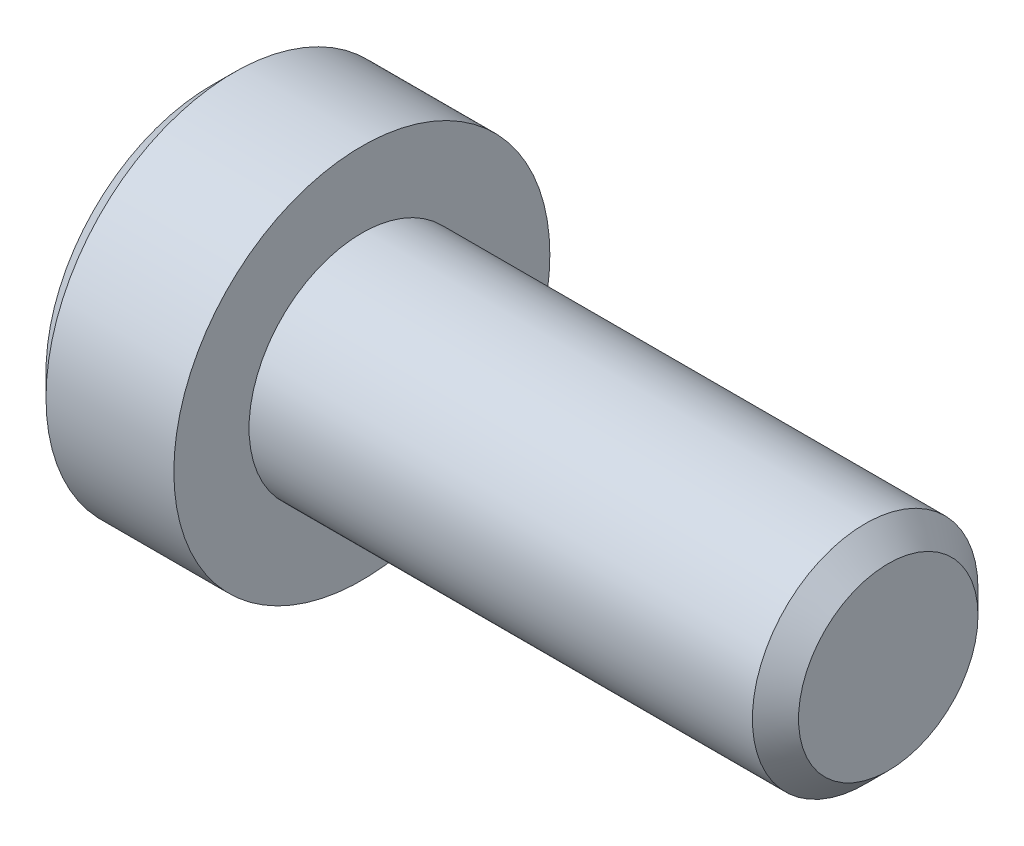
ISO-10303-21;
HEADER;
FILE_DESCRIPTION(('STEP AP214'),'2;1');
FILE_NAME('part.step','',(''),(''),'','','');
FILE_SCHEMA(('AUTOMOTIVE_DESIGN { 1 0 10303 214 1 1 1 1 }'));
ENDSEC;
DATA;
#1=APPLICATION_CONTEXT('core data for automotive mechanical design processes');
#2=APPLICATION_PROTOCOL_DEFINITION('international standard','automotive_design',2000,#1);
#3=PRODUCT_CONTEXT('',#1,'mechanical');
#4=PRODUCT('Part','Part','',(#3));
#5=PRODUCT_RELATED_PRODUCT_CATEGORY('part','',(#4));
#6=PRODUCT_DEFINITION_FORMATION('','',#4);
#7=PRODUCT_DEFINITION_CONTEXT('part definition',#1,'design');
#8=PRODUCT_DEFINITION('design','',#6,#7);
#9=PRODUCT_DEFINITION_SHAPE('','',#8);
#10=(LENGTH_UNIT() NAMED_UNIT(*) SI_UNIT(.MILLI.,.METRE.));
#11=(NAMED_UNIT(*) PLANE_ANGLE_UNIT() SI_UNIT($,.RADIAN.));
#12=(NAMED_UNIT(*) SI_UNIT($,.STERADIAN.) SOLID_ANGLE_UNIT());
#13=UNCERTAINTY_MEASURE_WITH_UNIT(LENGTH_MEASURE(1.E-05),#10,'distance_accuracy_value','');
#14=(GEOMETRIC_REPRESENTATION_CONTEXT(3) GLOBAL_UNCERTAINTY_ASSIGNED_CONTEXT((#13)) GLOBAL_UNIT_ASSIGNED_CONTEXT((#10,
#11,#12)) REPRESENTATION_CONTEXT('',''));
#15=CARTESIAN_POINT('',(0.,0.,0.));
#16=DIRECTION('',(0.,0.,1.));
#17=DIRECTION('',(1.,0.,0.));
#18=AXIS2_PLACEMENT_3D('',#15,#16,#17);
#19=CARTESIAN_POINT('',(-4.,0.,0.));
#20=DIRECTION('',(1.,0.,0.));
#21=DIRECTION('',(0.,0.,-1.));
#22=AXIS2_PLACEMENT_3D('',#19,#20,#21);
#23=PLANE('',#22);
#24=CARTESIAN_POINT('',(-4.,0.,0.));
#25=DIRECTION('',(1.,0.,0.));
#26=DIRECTION('',(0.,0.,-1.));
#27=AXIS2_PLACEMENT_3D('',#24,#25,#26);
#28=CIRCLE('',#27,4.4);
#29=CARTESIAN_POINT('',(-4.,0.,-4.4));
#30=VERTEX_POINT('',#29);
#31=EDGE_CURVE('E116',#30,#30,#28,.T.);
#32=ORIENTED_EDGE('',*,*,#31,.F.);
#33=EDGE_LOOP('',(#32));
#34=FACE_BOUND('',#33,.T.);
#35=DIRECTION('',(0.,0.499999999999983,-0.866025403784448));
#36=VECTOR('',#35,1.);
#37=CARTESIAN_POINT('',(-4.,-2.3094010767585,0.));
#38=LINE('',#37,#36);
#39=CARTESIAN_POINT('',(-4.,-2.3094010767585,0.));
#40=VERTEX_POINT('',#39);
#41=CARTESIAN_POINT('',(-4.,-1.1547005383793,-2.));
#42=VERTEX_POINT('',#41);
#43=EDGE_CURVE('E101',#40,#42,#38,.T.);
#44=ORIENTED_EDGE('',*,*,#43,.T.);
#45=DIRECTION('',(0.,1.,0.));
#46=VECTOR('',#45,1.);
#47=CARTESIAN_POINT('',(-4.,-1.1547005383793,-2.));
#48=LINE('',#47,#46);
#49=CARTESIAN_POINT('',(-4.,1.1547005383793,-2.));
#50=VERTEX_POINT('',#49);
#51=EDGE_CURVE('E89',#42,#50,#48,.T.);
#52=ORIENTED_EDGE('',*,*,#51,.T.);
#53=DIRECTION('',(0.,0.499999999999983,0.866025403784448));
#54=VECTOR('',#53,1.);
#55=CARTESIAN_POINT('',(-4.,1.1547005383793,-2.));
#56=LINE('',#55,#54);
#57=CARTESIAN_POINT('',(-4.,2.3094010767585,0.));
#58=VERTEX_POINT('',#57);
#59=EDGE_CURVE('E100',#50,#58,#56,.T.);
#60=ORIENTED_EDGE('',*,*,#59,.T.);
#61=DIRECTION('',(0.,-0.499999999999983,0.866025403784448));
#62=VECTOR('',#61,1.);
#63=CARTESIAN_POINT('',(-4.,2.3094010767585,0.));
#64=LINE('',#63,#62);
#65=CARTESIAN_POINT('',(-4.,1.1547005383793,2.));
#66=VERTEX_POINT('',#65);
#67=EDGE_CURVE('E126',#58,#66,#64,.T.);
#68=ORIENTED_EDGE('',*,*,#67,.T.);
#69=DIRECTION('',(0.,-1.,0.));
#70=VECTOR('',#69,1.);
#71=CARTESIAN_POINT('',(-4.,1.1547005383793,2.));
#72=LINE('',#71,#70);
#73=CARTESIAN_POINT('',(-4.,-1.1547005383793,2.));
#74=VERTEX_POINT('',#73);
#75=EDGE_CURVE('E131',#66,#74,#72,.T.);
#76=ORIENTED_EDGE('',*,*,#75,.T.);
#77=DIRECTION('',(0.,-0.499999999999983,-0.866025403784448));
#78=VECTOR('',#77,1.);
#79=CARTESIAN_POINT('',(-4.,-1.1547005383793,2.));
#80=LINE('',#79,#78);
#81=EDGE_CURVE('E115',#74,#40,#80,.T.);
#82=ORIENTED_EDGE('',*,*,#81,.T.);
#83=EDGE_LOOP('',(#44,#52,#60,#68,#76,#82));
#84=FACE_BOUND('',#83,.T.);
#85=ADVANCED_FACE('F17',(#34,#84),#23,.F.);
#86=CARTESIAN_POINT('',(-4.,0.,0.));
#87=DIRECTION('',(1.,0.,0.));
#88=DIRECTION('',(0.,0.,-1.));
#89=AXIS2_PLACEMENT_3D('',#86,#87,#88);
#90=CONICAL_SURFACE('',#89,4.4,0.785398163397445);
#91=CARTESIAN_POINT('',(-3.4,0.,0.));
#92=DIRECTION('',(1.,0.,0.));
#93=DIRECTION('',(0.,0.,-1.));
#94=AXIS2_PLACEMENT_3D('',#91,#92,#93);
#95=CIRCLE('',#94,5.);
#96=CARTESIAN_POINT('',(-3.4,0.,-5.));
#97=VERTEX_POINT('',#96);
#98=EDGE_CURVE('E138',#97,#97,#95,.T.);
#99=ORIENTED_EDGE('',*,*,#98,.F.);
#100=EDGE_LOOP('',(#99));
#101=FACE_BOUND('',#100,.T.);
#102=ORIENTED_EDGE('',*,*,#31,.T.);
#103=EDGE_LOOP('',(#102));
#104=FACE_BOUND('',#103,.T.);
#105=ADVANCED_FACE('F280',(#101,#104),#90,.T.);
#106=CARTESIAN_POINT('',(-1.,-2.3094010767585,0.));
#107=DIRECTION('',(0.,0.866025403784449,0.499999999999983));
#108=DIRECTION('',(0.,-0.499999999999983,0.866025403784449));
#109=AXIS2_PLACEMENT_3D('',#106,#107,#108);
#110=PLANE('',#109);
#111=ORIENTED_EDGE('',*,*,#43,.F.);
#112=DIRECTION('',(-1.,0.,0.));
#113=VECTOR('',#112,1.);
#114=CARTESIAN_POINT('',(-1.,-2.3094010767585,0.));
#115=LINE('',#114,#113);
#116=CARTESIAN_POINT('',(-1.,-2.3094010767585,0.));
#117=VERTEX_POINT('',#116);
#118=EDGE_CURVE('E143',#117,#40,#115,.T.);
#119=ORIENTED_EDGE('',*,*,#118,.F.);
#120=DIRECTION('',(0.,0.499999999999983,-0.866025403784448));
#121=VECTOR('',#120,1.);
#122=CARTESIAN_POINT('',(-1.,-2.3094010767585,0.));
#123=LINE('',#122,#121);
#124=CARTESIAN_POINT('',(-1.,-1.73205080756889,-0.999999999999966));
#125=VERTEX_POINT('',#124);
#126=EDGE_CURVE('E145',#117,#125,#123,.T.);
#127=ORIENTED_EDGE('',*,*,#126,.T.);
#128=DIRECTION('',(0.,0.499999999999983,-0.866025403784448));
#129=VECTOR('',#128,1.);
#130=CARTESIAN_POINT('',(-1.,-1.73205080756891,-0.999999999999977));
#131=LINE('',#130,#129);
#132=CARTESIAN_POINT('',(-1.,-1.1547005383793,-2.));
#133=VERTEX_POINT('',#132);
#134=EDGE_CURVE('E110',#125,#133,#131,.T.);
#135=ORIENTED_EDGE('',*,*,#134,.T.);
#136=DIRECTION('',(-1.,0.,0.));
#137=VECTOR('',#136,1.);
#138=CARTESIAN_POINT('',(-1.,-1.1547005383793,-2.));
#139=LINE('',#138,#137);
#140=EDGE_CURVE('E93',#133,#42,#139,.T.);
#141=ORIENTED_EDGE('',*,*,#140,.T.);
#142=EDGE_LOOP('',(#111,#119,#127,#135,#141));
#143=FACE_BOUND('',#142,.T.);
#144=ADVANCED_FACE('F106',(#143),#110,.T.);
#145=CARTESIAN_POINT('',(-1.,-1.1547005383793,-2.));
#146=DIRECTION('',(0.,0.,1.));
#147=DIRECTION('',(1.,0.,0.));
#148=AXIS2_PLACEMENT_3D('',#145,#146,#147);
#149=PLANE('',#148);
#150=ORIENTED_EDGE('',*,*,#51,.F.);
#151=ORIENTED_EDGE('',*,*,#140,.F.);
#152=DIRECTION('',(0.,1.,0.));
#153=VECTOR('',#152,1.);
#154=CARTESIAN_POINT('',(-1.,-1.1547005383793,-2.));
#155=LINE('',#154,#153);
#156=CARTESIAN_POINT('',(-1.,0.,-2.));
#157=VERTEX_POINT('',#156);
#158=EDGE_CURVE('E111',#133,#157,#155,.T.);
#159=ORIENTED_EDGE('',*,*,#158,.T.);
#160=DIRECTION('',(0.,1.,0.));
#161=VECTOR('',#160,1.);
#162=CARTESIAN_POINT('',(-1.,0.,-2.));
#163=LINE('',#162,#161);
#164=CARTESIAN_POINT('',(-1.,1.1547005383793,-2.));
#165=VERTEX_POINT('',#164);
#166=EDGE_CURVE('E157',#157,#165,#163,.T.);
#167=ORIENTED_EDGE('',*,*,#166,.T.);
#168=DIRECTION('',(-1.,0.,0.));
#169=VECTOR('',#168,1.);
#170=CARTESIAN_POINT('',(-1.,1.1547005383793,-2.));
#171=LINE('',#170,#169);
#172=EDGE_CURVE('E96',#165,#50,#171,.T.);
#173=ORIENTED_EDGE('',*,*,#172,.T.);
#174=EDGE_LOOP('',(#150,#151,#159,#167,#173));
#175=FACE_BOUND('',#174,.T.);
#176=ADVANCED_FACE('F91',(#175),#149,.T.);
#177=CARTESIAN_POINT('',(-1.,1.1547005383793,-2.));
#178=DIRECTION('',(0.,-0.866025403784449,0.499999999999983));
#179=DIRECTION('',(0.,-0.499999999999983,-0.866025403784449));
#180=AXIS2_PLACEMENT_3D('',#177,#178,#179);
#181=PLANE('',#180);
#182=ORIENTED_EDGE('',*,*,#59,.F.);
#183=ORIENTED_EDGE('',*,*,#172,.F.);
#184=DIRECTION('',(0.,0.499999999999983,0.866025403784448));
#185=VECTOR('',#184,1.);
#186=CARTESIAN_POINT('',(-1.,1.1547005383793,-2.));
#187=LINE('',#186,#185);
#188=CARTESIAN_POINT('',(-1.,1.73205080756891,-0.999999999999976));
#189=VERTEX_POINT('',#188);
#190=EDGE_CURVE('E164',#165,#189,#187,.T.);
#191=ORIENTED_EDGE('',*,*,#190,.T.);
#192=DIRECTION('',(0.,0.499999999999983,0.866025403784448));
#193=VECTOR('',#192,1.);
#194=CARTESIAN_POINT('',(-1.,1.73205080756891,-0.999999999999975));
#195=LINE('',#194,#193);
#196=CARTESIAN_POINT('',(-1.,2.3094010767585,0.));
#197=VERTEX_POINT('',#196);
#198=EDGE_CURVE('E169',#189,#197,#195,.T.);
#199=ORIENTED_EDGE('',*,*,#198,.T.);
#200=DIRECTION('',(-1.,0.,0.));
#201=VECTOR('',#200,1.);
#202=CARTESIAN_POINT('',(-1.,2.3094010767585,0.));
#203=LINE('',#202,#201);
#204=EDGE_CURVE('E174',#197,#58,#203,.T.);
#205=ORIENTED_EDGE('',*,*,#204,.T.);
#206=EDGE_LOOP('',(#182,#183,#191,#199,#205));
#207=FACE_BOUND('',#206,.T.);
#208=ADVANCED_FACE('F296',(#207),#181,.T.);
#209=CARTESIAN_POINT('',(-1.,2.3094010767585,0.));
#210=DIRECTION('',(0.,-0.866025403784449,-0.499999999999983));
#211=DIRECTION('',(0.,0.499999999999983,-0.866025403784449));
#212=AXIS2_PLACEMENT_3D('',#209,#210,#211);
#213=PLANE('',#212);
#214=ORIENTED_EDGE('',*,*,#67,.F.);
#215=ORIENTED_EDGE('',*,*,#204,.F.);
#216=DIRECTION('',(0.,-0.499999999999983,0.866025403784448));
#217=VECTOR('',#216,1.);
#218=CARTESIAN_POINT('',(-1.,2.3094010767585,0.));
#219=LINE('',#218,#217);
#220=CARTESIAN_POINT('',(-1.,1.73205080756891,0.999999999999976));
#221=VERTEX_POINT('',#220);
#222=EDGE_CURVE('E179',#197,#221,#219,.T.);
#223=ORIENTED_EDGE('',*,*,#222,.T.);
#224=DIRECTION('',(0.,-0.499999999999983,0.866025403784448));
#225=VECTOR('',#224,1.);
#226=CARTESIAN_POINT('',(-1.,1.73205080756891,0.999999999999976));
#227=LINE('',#226,#225);
#228=CARTESIAN_POINT('',(-1.,1.1547005383793,2.));
#229=VERTEX_POINT('',#228);
#230=EDGE_CURVE('E184',#221,#229,#227,.T.);
#231=ORIENTED_EDGE('',*,*,#230,.T.);
#232=DIRECTION('',(-1.,0.,0.));
#233=VECTOR('',#232,1.);
#234=CARTESIAN_POINT('',(-1.,1.1547005383793,2.));
#235=LINE('',#234,#233);
#236=EDGE_CURVE('E189',#229,#66,#235,.T.);
#237=ORIENTED_EDGE('',*,*,#236,.T.);
#238=EDGE_LOOP('',(#214,#215,#223,#231,#237));
#239=FACE_BOUND('',#238,.T.);
#240=ADVANCED_FACE('F299',(#239),#213,.T.);
#241=CARTESIAN_POINT('',(-1.,1.1547005383793,2.));
#242=DIRECTION('',(0.,0.,-1.));
#243=DIRECTION('',(-1.,0.,0.));
#244=AXIS2_PLACEMENT_3D('',#241,#242,#243);
#245=PLANE('',#244);
#246=ORIENTED_EDGE('',*,*,#75,.F.);
#247=ORIENTED_EDGE('',*,*,#236,.F.);
#248=DIRECTION('',(0.,-1.,0.));
#249=VECTOR('',#248,1.);
#250=CARTESIAN_POINT('',(-1.,1.1547005383793,2.));
#251=LINE('',#250,#249);
#252=CARTESIAN_POINT('',(-1.,0.,2.));
#253=VERTEX_POINT('',#252);
#254=EDGE_CURVE('E194',#229,#253,#251,.T.);
#255=ORIENTED_EDGE('',*,*,#254,.T.);
#256=DIRECTION('',(0.,-1.,0.));
#257=VECTOR('',#256,1.);
#258=CARTESIAN_POINT('',(-1.,0.,2.));
#259=LINE('',#258,#257);
#260=CARTESIAN_POINT('',(-1.,-1.1547005383793,2.));
#261=VERTEX_POINT('',#260);
#262=EDGE_CURVE('E199',#253,#261,#259,.T.);
#263=ORIENTED_EDGE('',*,*,#262,.T.);
#264=DIRECTION('',(-1.,0.,0.));
#265=VECTOR('',#264,1.);
#266=CARTESIAN_POINT('',(-1.,-1.1547005383793,2.));
#267=LINE('',#266,#265);
#268=EDGE_CURVE('E204',#261,#74,#267,.T.);
#269=ORIENTED_EDGE('',*,*,#268,.T.);
#270=EDGE_LOOP('',(#246,#247,#255,#263,#269));
#271=FACE_BOUND('',#270,.T.);
#272=ADVANCED_FACE('F303',(#271),#245,.T.);
#273=CARTESIAN_POINT('',(-1.,-1.1547005383793,2.));
#274=DIRECTION('',(0.,0.866025403784449,-0.499999999999983));
#275=DIRECTION('',(0.,0.499999999999983,0.866025403784449));
#276=AXIS2_PLACEMENT_3D('',#273,#274,#275);
#277=PLANE('',#276);
#278=ORIENTED_EDGE('',*,*,#81,.F.);
#279=ORIENTED_EDGE('',*,*,#268,.F.);
#280=DIRECTION('',(0.,-0.499999999999983,-0.866025403784448));
#281=VECTOR('',#280,1.);
#282=CARTESIAN_POINT('',(-1.,-1.1547005383793,2.));
#283=LINE('',#282,#281);
#284=CARTESIAN_POINT('',(-1.,-1.73205080756891,0.999999999999976));
#285=VERTEX_POINT('',#284);
#286=EDGE_CURVE('E209',#261,#285,#283,.T.);
#287=ORIENTED_EDGE('',*,*,#286,.T.);
#288=DIRECTION('',(0.,-0.499999999999983,-0.866025403784448));
#289=VECTOR('',#288,1.);
#290=CARTESIAN_POINT('',(-1.,-1.73205080756891,0.999999999999975));
#291=LINE('',#290,#289);
#292=EDGE_CURVE('E214',#285,#117,#291,.T.);
#293=ORIENTED_EDGE('',*,*,#292,.T.);
#294=ORIENTED_EDGE('',*,*,#118,.T.);
#295=EDGE_LOOP('',(#278,#279,#287,#293,#294));
#296=FACE_BOUND('',#295,.T.);
#297=ADVANCED_FACE('F276',(#296),#277,.T.);
#298=CARTESIAN_POINT('',(14.,0.,0.));
#299=DIRECTION('',(1.,0.,0.));
#300=DIRECTION('',(0.,0.,-1.));
#301=AXIS2_PLACEMENT_3D('',#298,#299,#300);
#302=CYLINDRICAL_SURFACE('',#301,5.);
#303=CARTESIAN_POINT('',(0.,0.,0.));
#304=DIRECTION('',(1.,0.,0.));
#305=DIRECTION('',(0.,0.,-1.));
#306=AXIS2_PLACEMENT_3D('',#303,#304,#305);
#307=CIRCLE('',#306,5.);
#308=CARTESIAN_POINT('',(0.,0.,-5.));
#309=VERTEX_POINT('',#308);
#310=EDGE_CURVE('E219',#309,#309,#307,.T.);
#311=ORIENTED_EDGE('',*,*,#310,.F.);
#312=EDGE_LOOP('',(#311));
#313=FACE_BOUND('',#312,.T.);
#314=ORIENTED_EDGE('',*,*,#98,.T.);
#315=EDGE_LOOP('',(#314));
#316=FACE_BOUND('',#315,.T.);
#317=ADVANCED_FACE('F272',(#313,#316),#302,.T.);
#318=CARTESIAN_POINT('',(-1.,0.,0.));
#319=DIRECTION('',(1.,0.,0.));
#320=DIRECTION('',(0.,0.,-1.));
#321=AXIS2_PLACEMENT_3D('',#318,#319,#320);
#322=PLANE('',#321);
#323=CARTESIAN_POINT('',(-1.,0.,0.));
#324=DIRECTION('',(1.,0.,0.));
#325=DIRECTION('',(0.,-0.866025403784449,0.499999999999983));
#326=AXIS2_PLACEMENT_3D('',#323,#324,#325);
#327=CIRCLE('',#326,2.);
#328=EDGE_CURVE('E35',#285,#125,#327,.T.);
#329=ORIENTED_EDGE('',*,*,#328,.T.);
#330=ORIENTED_EDGE('',*,*,#126,.F.);
#331=ORIENTED_EDGE('',*,*,#292,.F.);
#332=EDGE_LOOP('',(#329,#330,#331));
#333=FACE_BOUND('',#332,.T.);
#334=ADVANCED_FACE('F275',(#333),#322,.F.);
#335=CARTESIAN_POINT('',(-1.,0.,0.));
#336=DIRECTION('',(1.,0.,0.));
#337=DIRECTION('',(0.,-0.866025403784448,-0.499999999999983));
#338=AXIS2_PLACEMENT_3D('',#335,#336,#337);
#339=CIRCLE('',#338,2.);
#340=EDGE_CURVE('E225',#125,#157,#339,.T.);
#341=ORIENTED_EDGE('',*,*,#340,.T.);
#342=ORIENTED_EDGE('',*,*,#158,.F.);
#343=ORIENTED_EDGE('',*,*,#134,.F.);
#344=EDGE_LOOP('',(#341,#342,#343));
#345=FACE_BOUND('',#344,.T.);
#346=ADVANCED_FACE('F312',(#345),#322,.F.);
#347=CARTESIAN_POINT('',(-1.,0.,0.));
#348=DIRECTION('',(1.,0.,0.));
#349=DIRECTION('',(0.,0.,-1.));
#350=AXIS2_PLACEMENT_3D('',#347,#348,#349);
#351=CIRCLE('',#350,2.);
#352=EDGE_CURVE('E230',#157,#189,#351,.T.);
#353=ORIENTED_EDGE('',*,*,#352,.T.);
#354=ORIENTED_EDGE('',*,*,#190,.F.);
#355=ORIENTED_EDGE('',*,*,#166,.F.);
#356=EDGE_LOOP('',(#353,#354,#355));
#357=FACE_BOUND('',#356,.T.);
#358=ADVANCED_FACE('F379',(#357),#322,.F.);
#359=CARTESIAN_POINT('',(-1.,0.,0.));
#360=DIRECTION('',(1.,0.,0.));
#361=DIRECTION('',(0.,0.866025403784448,-0.499999999999983));
#362=AXIS2_PLACEMENT_3D('',#359,#360,#361);
#363=CIRCLE('',#362,2.);
#364=EDGE_CURVE('E235',#189,#221,#363,.T.);
#365=ORIENTED_EDGE('',*,*,#364,.T.);
#366=ORIENTED_EDGE('',*,*,#222,.F.);
#367=ORIENTED_EDGE('',*,*,#198,.F.);
#368=EDGE_LOOP('',(#365,#366,#367));
#369=FACE_BOUND('',#368,.T.);
#370=ADVANCED_FACE('F370',(#369),#322,.F.);
#371=CARTESIAN_POINT('',(-1.,0.,0.));
#372=DIRECTION('',(1.,0.,0.));
#373=DIRECTION('',(0.,0.866025403784449,0.499999999999983));
#374=AXIS2_PLACEMENT_3D('',#371,#372,#373);
#375=CIRCLE('',#374,2.);
#376=EDGE_CURVE('E240',#221,#253,#375,.T.);
#377=ORIENTED_EDGE('',*,*,#376,.T.);
#378=ORIENTED_EDGE('',*,*,#254,.F.);
#379=ORIENTED_EDGE('',*,*,#230,.F.);
#380=EDGE_LOOP('',(#377,#378,#379));
#381=FACE_BOUND('',#380,.T.);
#382=ADVANCED_FACE('F361',(#381),#322,.F.);
#383=CARTESIAN_POINT('',(-1.,0.,0.));
#384=DIRECTION('',(1.,0.,0.));
#385=DIRECTION('',(0.,0.,1.));
#386=AXIS2_PLACEMENT_3D('',#383,#384,#385);
#387=CIRCLE('',#386,2.);
#388=EDGE_CURVE('E245',#253,#285,#387,.T.);
#389=ORIENTED_EDGE('',*,*,#388,.T.);
#390=ORIENTED_EDGE('',*,*,#286,.F.);
#391=ORIENTED_EDGE('',*,*,#262,.F.);
#392=EDGE_LOOP('',(#389,#390,#391));
#393=FACE_BOUND('',#392,.T.);
#394=ADVANCED_FACE('F268',(#393),#322,.F.);
#395=CARTESIAN_POINT('',(0.,5.,0.));
#396=DIRECTION('',(-1.,0.,0.));
#397=DIRECTION('',(0.,0.,1.));
#398=AXIS2_PLACEMENT_3D('',#395,#396,#397);
#399=PLANE('',#398);
#400=CARTESIAN_POINT('',(0.,0.,0.));
#401=DIRECTION('',(1.,0.,0.));
#402=DIRECTION('',(0.,0.,-1.));
#403=AXIS2_PLACEMENT_3D('',#400,#401,#402);
#404=CIRCLE('',#403,3.);
#405=CARTESIAN_POINT('',(0.,0.,-3.));
#406=VERTEX_POINT('',#405);
#407=EDGE_CURVE('E249',#406,#406,#404,.T.);
#408=ORIENTED_EDGE('',*,*,#407,.F.);
#409=EDGE_LOOP('',(#408));
#410=FACE_BOUND('',#409,.T.);
#411=ORIENTED_EDGE('',*,*,#310,.T.);
#412=EDGE_LOOP('',(#411));
#413=FACE_BOUND('',#412,.T.);
#414=ADVANCED_FACE('F265',(#410,#413),#399,.F.);
#415=CARTESIAN_POINT('',(-1.,0.,0.));
#416=DIRECTION('',(-1.,0.,0.));
#417=DIRECTION('',(0.,0.,1.));
#418=AXIS2_PLACEMENT_3D('',#415,#416,#417);
#419=CONICAL_SURFACE('',#418,2.,1.0471975511966);
#420=CARTESIAN_POINT('',(0.15470053837925,0.,0.));
#421=VERTEX_POINT('',#420);
#422=VERTEX_LOOP('',#421);
#423=FACE_BOUND('',#422,.T.);
#424=ORIENTED_EDGE('',*,*,#352,.F.);
#425=ORIENTED_EDGE('',*,*,#340,.F.);
#426=ORIENTED_EDGE('',*,*,#328,.F.);
#427=ORIENTED_EDGE('',*,*,#388,.F.);
#428=ORIENTED_EDGE('',*,*,#376,.F.);
#429=ORIENTED_EDGE('',*,*,#364,.F.);
#430=EDGE_LOOP('',(#424,#425,#426,#427,#428,#429));
#431=FACE_BOUND('',#430,.T.);
#432=ADVANCED_FACE('F261',(#423,#431),#419,.F.);
#433=CARTESIAN_POINT('',(14.,0.,0.));
#434=DIRECTION('',(1.,0.,0.));
#435=DIRECTION('',(0.,0.,-1.));
#436=AXIS2_PLACEMENT_3D('',#433,#434,#435);
#437=CYLINDRICAL_SURFACE('',#436,3.);
#438=CARTESIAN_POINT('',(13.3865,0.,0.));
#439=DIRECTION('',(1.,0.,0.));
#440=DIRECTION('',(0.,0.,-1.));
#441=AXIS2_PLACEMENT_3D('',#438,#439,#440);
#442=CIRCLE('',#441,3.);
#443=CARTESIAN_POINT('',(13.3865,0.,-3.));
#444=VERTEX_POINT('',#443);
#445=EDGE_CURVE('E25',#444,#444,#442,.T.);
#446=ORIENTED_EDGE('',*,*,#445,.F.);
#447=EDGE_LOOP('',(#446));
#448=FACE_BOUND('',#447,.T.);
#449=ORIENTED_EDGE('',*,*,#407,.T.);
#450=EDGE_LOOP('',(#449));
#451=FACE_BOUND('',#450,.T.);
#452=ADVANCED_FACE('F258',(#448,#451),#437,.T.);
#453=CARTESIAN_POINT('',(13.3865,0.,0.));
#454=DIRECTION('',(-1.,0.,0.));
#455=DIRECTION('',(0.,0.,1.));
#456=AXIS2_PLACEMENT_3D('',#453,#454,#455);
#457=CONICAL_SURFACE('',#456,3.,0.785398163397449);
#458=CARTESIAN_POINT('',(14.,0.,0.));
#459=DIRECTION('',(1.,0.,0.));
#460=DIRECTION('',(0.,0.,-1.));
#461=AXIS2_PLACEMENT_3D('',#458,#459,#460);
#462=CIRCLE('',#461,2.3865);
#463=CARTESIAN_POINT('',(14.,0.,-2.3865));
#464=VERTEX_POINT('',#463);
#465=EDGE_CURVE('E11',#464,#464,#462,.T.);
#466=ORIENTED_EDGE('',*,*,#465,.F.);
#467=EDGE_LOOP('',(#466));
#468=FACE_BOUND('',#467,.T.);
#469=ORIENTED_EDGE('',*,*,#445,.T.);
#470=EDGE_LOOP('',(#469));
#471=FACE_BOUND('',#470,.T.);
#472=ADVANCED_FACE('F256',(#468,#471),#457,.T.);
#473=CARTESIAN_POINT('',(14.,2.3865,0.));
#474=DIRECTION('',(-1.,0.,0.));
#475=DIRECTION('',(0.,0.,1.));
#476=AXIS2_PLACEMENT_3D('',#473,#474,#475);
#477=PLANE('',#476);
#478=ORIENTED_EDGE('',*,*,#465,.T.);
#479=EDGE_LOOP('',(#478));
#480=FACE_BOUND('',#479,.T.);
#481=ADVANCED_FACE('F19',(#480),#477,.F.);
#482=CLOSED_SHELL('',(#85,#105,#144,#176,#208,#240,#272,#297,#317,#334,#346,#358,#370,#382,#394,
#414,#432,#452,#472,#481));
#483=MANIFOLD_SOLID_BREP('B1',#482);
#484=ADVANCED_BREP_SHAPE_REPRESENTATION('',(#18,#483),#14);
#485=SHAPE_DEFINITION_REPRESENTATION(#9,#484);
ENDSEC;
END-ISO-10303-21;
